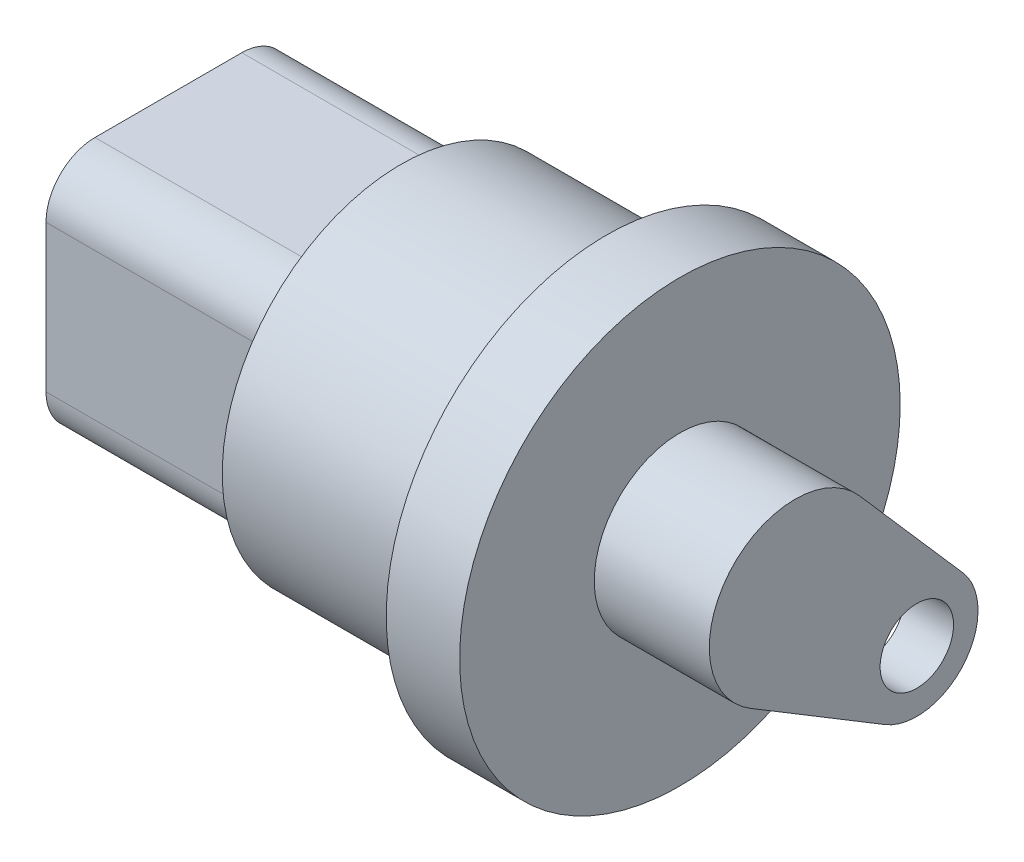
ISO-10303-21;
HEADER;
FILE_DESCRIPTION(('STEP AP214'),'2;1');
FILE_NAME('part.step','',(''),(''),'','','');
FILE_SCHEMA(('AUTOMOTIVE_DESIGN { 1 0 10303 214 1 1 1 1 }'));
ENDSEC;
DATA;
#1=APPLICATION_CONTEXT('core data for automotive mechanical design processes');
#2=APPLICATION_PROTOCOL_DEFINITION('international standard','automotive_design',2000,#1);
#3=PRODUCT_CONTEXT('',#1,'mechanical');
#4=PRODUCT('Part','Part','',(#3));
#5=PRODUCT_RELATED_PRODUCT_CATEGORY('part','',(#4));
#6=PRODUCT_DEFINITION_FORMATION('','',#4);
#7=PRODUCT_DEFINITION_CONTEXT('part definition',#1,'design');
#8=PRODUCT_DEFINITION('design','',#6,#7);
#9=PRODUCT_DEFINITION_SHAPE('','',#8);
#10=(LENGTH_UNIT() NAMED_UNIT(*) SI_UNIT(.MILLI.,.METRE.));
#11=(NAMED_UNIT(*) PLANE_ANGLE_UNIT() SI_UNIT($,.RADIAN.));
#12=(NAMED_UNIT(*) SI_UNIT($,.STERADIAN.) SOLID_ANGLE_UNIT());
#13=UNCERTAINTY_MEASURE_WITH_UNIT(LENGTH_MEASURE(1.E-05),#10,'distance_accuracy_value','');
#14=(GEOMETRIC_REPRESENTATION_CONTEXT(3) GLOBAL_UNCERTAINTY_ASSIGNED_CONTEXT((#13)) GLOBAL_UNIT_ASSIGNED_CONTEXT((#10,
#11,#12)) REPRESENTATION_CONTEXT('',''));
#15=CARTESIAN_POINT('',(0.,0.,0.));
#16=DIRECTION('',(0.,0.,1.));
#17=DIRECTION('',(1.,0.,0.));
#18=AXIS2_PLACEMENT_3D('',#15,#16,#17);
#19=CARTESIAN_POINT('',(3.,0.,0.));
#20=DIRECTION('',(-1.,0.,0.));
#21=DIRECTION('',(0.,0.,1.));
#22=AXIS2_PLACEMENT_3D('',#19,#20,#21);
#23=CYLINDRICAL_SURFACE('',#22,9.);
#24=CARTESIAN_POINT('',(3.,0.,0.));
#25=DIRECTION('',(1.,0.,0.));
#26=DIRECTION('',(0.,0.,-1.));
#27=AXIS2_PLACEMENT_3D('',#24,#25,#26);
#28=CIRCLE('',#27,9.);
#29=CARTESIAN_POINT('',(3.,0.,-9.));
#30=VERTEX_POINT('',#29);
#31=EDGE_CURVE('E175',#30,#30,#28,.T.);
#32=ORIENTED_EDGE('',*,*,#31,.F.);
#33=EDGE_LOOP('',(#32));
#34=FACE_BOUND('',#33,.T.);
#35=CARTESIAN_POINT('',(0.,0.,0.));
#36=DIRECTION('',(1.,0.,0.));
#37=DIRECTION('',(0.,0.,-1.));
#38=AXIS2_PLACEMENT_3D('',#35,#36,#37);
#39=CIRCLE('',#38,9.);
#40=CARTESIAN_POINT('',(0.,0.,-9.));
#41=VERTEX_POINT('',#40);
#42=EDGE_CURVE('E179',#41,#41,#39,.T.);
#43=ORIENTED_EDGE('',*,*,#42,.T.);
#44=EDGE_LOOP('',(#43));
#45=FACE_BOUND('',#44,.T.);
#46=ADVANCED_FACE('F52',(#34,#45),#23,.T.);
#47=CARTESIAN_POINT('',(3.,0.,0.));
#48=DIRECTION('',(1.,0.,0.));
#49=DIRECTION('',(0.,0.,-1.));
#50=AXIS2_PLACEMENT_3D('',#47,#48,#49);
#51=PLANE('',#50);
#52=CARTESIAN_POINT('',(3.,-4.17811946296249,-4.97928888027336));
#53=DIRECTION('',(1.,0.,0.));
#54=DIRECTION('',(0.,0.,-1.));
#55=AXIS2_PLACEMENT_3D('',#52,#53,#54);
#56=CIRCLE('',#55,1.5);
#57=CARTESIAN_POINT('',(3.,-4.17811946296249,-6.47928888027336));
#58=VERTEX_POINT('',#57);
#59=EDGE_CURVE('E166',#58,#58,#56,.T.);
#60=ORIENTED_EDGE('',*,*,#59,.F.);
#61=EDGE_LOOP('',(#60));
#62=FACE_BOUND('',#61,.T.);
#63=CARTESIAN_POINT('',(3.,0.,0.));
#64=DIRECTION('',(1.,0.,0.));
#65=DIRECTION('',(0.,0.,-1.));
#66=AXIS2_PLACEMENT_3D('',#63,#64,#65);
#67=CIRCLE('',#66,3.5);
#68=CARTESIAN_POINT('',(3.,0.,-3.5));
#69=VERTEX_POINT('',#68);
#70=EDGE_CURVE('E178',#69,#69,#67,.T.);
#71=ORIENTED_EDGE('',*,*,#70,.F.);
#72=EDGE_LOOP('',(#71));
#73=FACE_BOUND('',#72,.T.);
#74=ORIENTED_EDGE('',*,*,#31,.T.);
#75=EDGE_LOOP('',(#74));
#76=FACE_BOUND('',#75,.T.);
#77=ADVANCED_FACE('F277',(#62,#73,#76),#51,.T.);
#78=CARTESIAN_POINT('',(0.,0.,0.));
#79=DIRECTION('',(1.,0.,0.));
#80=DIRECTION('',(0.,0.,-1.));
#81=AXIS2_PLACEMENT_3D('',#78,#79,#80);
#82=PLANE('',#81);
#83=CARTESIAN_POINT('',(0.,0.,0.));
#84=DIRECTION('',(1.,0.,0.));
#85=DIRECTION('',(0.,0.,-1.));
#86=AXIS2_PLACEMENT_3D('',#83,#84,#85);
#87=CIRCLE('',#86,7.3);
#88=CARTESIAN_POINT('',(0.,-3.58703931073588,-6.35792017748222));
#89=VERTEX_POINT('',#88);
#90=CARTESIAN_POINT('',(0.,-5.63844624428829,-4.63658537614388));
#91=VERTEX_POINT('',#90);
#92=EDGE_CURVE('E153',#89,#91,#87,.T.);
#93=ORIENTED_EDGE('',*,*,#92,.T.);
#94=CARTESIAN_POINT('',(0.,-4.17811946296249,-4.97928888027336));
#95=DIRECTION('',(1.,0.,0.));
#96=DIRECTION('',(0.,0.,-1.));
#97=AXIS2_PLACEMENT_3D('',#94,#95,#96);
#98=CIRCLE('',#97,1.5);
#99=EDGE_CURVE('E159',#89,#91,#98,.F.);
#100=ORIENTED_EDGE('',*,*,#99,.F.);
#101=EDGE_LOOP('',(#93,#100));
#102=FACE_BOUND('',#101,.T.);
#103=ORIENTED_EDGE('',*,*,#42,.F.);
#104=EDGE_LOOP('',(#103));
#105=FACE_BOUND('',#104,.T.);
#106=ADVANCED_FACE('F164',(#102,#105),#82,.F.);
#107=CARTESIAN_POINT('',(-8.4,0.,0.));
#108=DIRECTION('',(1.,0.,0.));
#109=DIRECTION('',(0.,0.,-1.));
#110=AXIS2_PLACEMENT_3D('',#107,#108,#109);
#111=CYLINDRICAL_SURFACE('',#110,7.3);
#112=CARTESIAN_POINT('',(-8.4,0.,0.));
#113=DIRECTION('',(1.,0.,0.));
#114=DIRECTION('',(0.,0.,-1.));
#115=AXIS2_PLACEMENT_3D('',#112,#113,#114);
#116=CIRCLE('',#115,7.3);
#117=CARTESIAN_POINT('',(-8.4,0.,-7.3));
#118=VERTEX_POINT('',#117);
#119=EDGE_CURVE('E152',#118,#118,#116,.T.);
#120=ORIENTED_EDGE('',*,*,#119,.T.);
#121=EDGE_LOOP('',(#120));
#122=FACE_BOUND('',#121,.T.);
#123=EDGE_CURVE('E145',#91,#89,#87,.T.);
#124=ORIENTED_EDGE('',*,*,#123,.F.);
#125=ORIENTED_EDGE('',*,*,#92,.F.);
#126=EDGE_LOOP('',(#124,#125));
#127=FACE_BOUND('',#126,.T.);
#128=ADVANCED_FACE('F167',(#122,#127),#111,.T.);
#129=CARTESIAN_POINT('',(-8.4,0.,0.));
#130=DIRECTION('',(1.,0.,0.));
#131=DIRECTION('',(0.,0.,-1.));
#132=AXIS2_PLACEMENT_3D('',#129,#130,#131);
#133=PLANE('',#132);
#134=DIRECTION('',(0.,0.,-1.));
#135=VECTOR('',#134,1.);
#136=CARTESIAN_POINT('',(-8.4,5.,0.));
#137=LINE('',#136,#135);
#138=CARTESIAN_POINT('',(-8.4,5.,3.));
#139=VERTEX_POINT('',#138);
#140=CARTESIAN_POINT('',(-8.4,5.,-3.));
#141=VERTEX_POINT('',#140);
#142=EDGE_CURVE('E242',#139,#141,#137,.T.);
#143=ORIENTED_EDGE('',*,*,#142,.F.);
#144=CARTESIAN_POINT('',(-8.4,3.,3.));
#145=DIRECTION('',(1.,0.,0.));
#146=DIRECTION('',(0.,0.,-1.));
#147=AXIS2_PLACEMENT_3D('',#144,#145,#146);
#148=CIRCLE('',#147,2.);
#149=CARTESIAN_POINT('',(-8.4,3.,5.));
#150=VERTEX_POINT('',#149);
#151=EDGE_CURVE('E209',#139,#150,#148,.T.);
#152=ORIENTED_EDGE('',*,*,#151,.T.);
#153=DIRECTION('',(0.,-1.,0.));
#154=VECTOR('',#153,1.);
#155=CARTESIAN_POINT('',(-8.4,0.,5.));
#156=LINE('',#155,#154);
#157=CARTESIAN_POINT('',(-8.4,-3.,5.));
#158=VERTEX_POINT('',#157);
#159=EDGE_CURVE('E219',#150,#158,#156,.T.);
#160=ORIENTED_EDGE('',*,*,#159,.T.);
#161=CARTESIAN_POINT('',(-8.4,-3.,3.));
#162=DIRECTION('',(1.,0.,0.));
#163=DIRECTION('',(0.,0.,-1.));
#164=AXIS2_PLACEMENT_3D('',#161,#162,#163);
#165=CIRCLE('',#164,2.);
#166=CARTESIAN_POINT('',(-8.4,-5.,3.));
#167=VERTEX_POINT('',#166);
#168=EDGE_CURVE('E211',#158,#167,#165,.T.);
#169=ORIENTED_EDGE('',*,*,#168,.T.);
#170=DIRECTION('',(0.,0.,-1.));
#171=VECTOR('',#170,1.);
#172=CARTESIAN_POINT('',(-8.4,-5.,0.));
#173=LINE('',#172,#171);
#174=CARTESIAN_POINT('',(-8.4,-5.,-3.));
#175=VERTEX_POINT('',#174);
#176=EDGE_CURVE('E217',#167,#175,#173,.T.);
#177=ORIENTED_EDGE('',*,*,#176,.T.);
#178=CARTESIAN_POINT('',(-8.4,-3.,-3.));
#179=DIRECTION('',(1.,0.,0.));
#180=DIRECTION('',(0.,0.,-1.));
#181=AXIS2_PLACEMENT_3D('',#178,#179,#180);
#182=CIRCLE('',#181,2.);
#183=CARTESIAN_POINT('',(-8.4,-3.,-5.));
#184=VERTEX_POINT('',#183);
#185=EDGE_CURVE('E60',#175,#184,#182,.T.);
#186=ORIENTED_EDGE('',*,*,#185,.T.);
#187=DIRECTION('',(0.,-1.,0.));
#188=VECTOR('',#187,1.);
#189=CARTESIAN_POINT('',(-8.4,0.,-5.));
#190=LINE('',#189,#188);
#191=CARTESIAN_POINT('',(-8.4,3.,-5.));
#192=VERTEX_POINT('',#191);
#193=EDGE_CURVE('E228',#192,#184,#190,.T.);
#194=ORIENTED_EDGE('',*,*,#193,.F.);
#195=CARTESIAN_POINT('',(-8.4,3.,-3.));
#196=DIRECTION('',(1.,0.,0.));
#197=DIRECTION('',(0.,0.,-1.));
#198=AXIS2_PLACEMENT_3D('',#195,#196,#197);
#199=CIRCLE('',#198,2.);
#200=EDGE_CURVE('E12',#192,#141,#199,.T.);
#201=ORIENTED_EDGE('',*,*,#200,.T.);
#202=EDGE_LOOP('',(#143,#152,#160,#169,#177,#186,#194,#201));
#203=FACE_BOUND('',#202,.T.);
#204=ORIENTED_EDGE('',*,*,#119,.F.);
#205=EDGE_LOOP('',(#204));
#206=FACE_BOUND('',#205,.T.);
#207=ADVANCED_FACE('F215',(#203,#206),#133,.F.);
#208=CARTESIAN_POINT('',(-17.9,0.,5.));
#209=DIRECTION('',(0.,0.,1.));
#210=DIRECTION('',(0.,-1.,0.));
#211=AXIS2_PLACEMENT_3D('',#208,#209,#210);
#212=PLANE('',#211);
#213=ORIENTED_EDGE('',*,*,#159,.F.);
#214=DIRECTION('',(1.,0.,0.));
#215=VECTOR('',#214,1.);
#216=CARTESIAN_POINT('',(-17.9,3.,5.));
#217=LINE('',#216,#215);
#218=CARTESIAN_POINT('',(-17.9,3.,5.));
#219=VERTEX_POINT('',#218);
#220=EDGE_CURVE('E190',#150,#219,#217,.F.);
#221=ORIENTED_EDGE('',*,*,#220,.T.);
#222=DIRECTION('',(0.,-1.,0.));
#223=VECTOR('',#222,1.);
#224=CARTESIAN_POINT('',(-17.9,0.,5.));
#225=LINE('',#224,#223);
#226=CARTESIAN_POINT('',(-17.9,-3.,5.));
#227=VERTEX_POINT('',#226);
#228=EDGE_CURVE('E236',#219,#227,#225,.T.);
#229=ORIENTED_EDGE('',*,*,#228,.T.);
#230=DIRECTION('',(1.,0.,0.));
#231=VECTOR('',#230,1.);
#232=CARTESIAN_POINT('',(-17.9,-3.,5.));
#233=LINE('',#232,#231);
#234=EDGE_CURVE('E187',#227,#158,#233,.T.);
#235=ORIENTED_EDGE('',*,*,#234,.T.);
#236=EDGE_LOOP('',(#213,#221,#229,#235));
#237=FACE_BOUND('',#236,.T.);
#238=ADVANCED_FACE('F240',(#237),#212,.T.);
#239=CARTESIAN_POINT('',(-17.9,5.,0.));
#240=DIRECTION('',(0.,-1.,0.));
#241=DIRECTION('',(0.,0.,-1.));
#242=AXIS2_PLACEMENT_3D('',#239,#240,#241);
#243=PLANE('',#242);
#244=DIRECTION('',(0.,0.,-1.));
#245=VECTOR('',#244,1.);
#246=CARTESIAN_POINT('',(-17.9,5.,0.));
#247=LINE('',#246,#245);
#248=CARTESIAN_POINT('',(-17.9,5.,3.));
#249=VERTEX_POINT('',#248);
#250=CARTESIAN_POINT('',(-17.9,5.,-3.));
#251=VERTEX_POINT('',#250);
#252=EDGE_CURVE('E168',#249,#251,#247,.T.);
#253=ORIENTED_EDGE('',*,*,#252,.F.);
#254=DIRECTION('',(1.,0.,0.));
#255=VECTOR('',#254,1.);
#256=CARTESIAN_POINT('',(-8.4,5.,3.));
#257=LINE('',#256,#255);
#258=EDGE_CURVE('E184',#249,#139,#257,.T.);
#259=ORIENTED_EDGE('',*,*,#258,.T.);
#260=ORIENTED_EDGE('',*,*,#142,.T.);
#261=DIRECTION('',(1.,0.,0.));
#262=VECTOR('',#261,1.);
#263=CARTESIAN_POINT('',(-17.9,5.,-3.));
#264=LINE('',#263,#262);
#265=EDGE_CURVE('E182',#141,#251,#264,.F.);
#266=ORIENTED_EDGE('',*,*,#265,.T.);
#267=EDGE_LOOP('',(#253,#259,#260,#266));
#268=FACE_BOUND('',#267,.T.);
#269=ADVANCED_FACE('F263',(#268),#243,.F.);
#270=CARTESIAN_POINT('',(-17.9,0.,-5.));
#271=DIRECTION('',(0.,0.,1.));
#272=DIRECTION('',(0.,-1.,0.));
#273=AXIS2_PLACEMENT_3D('',#270,#271,#272);
#274=PLANE('',#273);
#275=ORIENTED_EDGE('',*,*,#193,.T.);
#276=DIRECTION('',(1.,0.,0.));
#277=VECTOR('',#276,1.);
#278=CARTESIAN_POINT('',(-17.9,-3.,-5.));
#279=LINE('',#278,#277);
#280=CARTESIAN_POINT('',(-17.9,-3.,-5.));
#281=VERTEX_POINT('',#280);
#282=EDGE_CURVE('E207',#184,#281,#279,.F.);
#283=ORIENTED_EDGE('',*,*,#282,.T.);
#284=DIRECTION('',(0.,-1.,0.));
#285=VECTOR('',#284,1.);
#286=CARTESIAN_POINT('',(-17.9,0.,-5.));
#287=LINE('',#286,#285);
#288=CARTESIAN_POINT('',(-17.9,3.,-5.));
#289=VERTEX_POINT('',#288);
#290=EDGE_CURVE('E170',#289,#281,#287,.T.);
#291=ORIENTED_EDGE('',*,*,#290,.F.);
#292=DIRECTION('',(1.,0.,0.));
#293=VECTOR('',#292,1.);
#294=CARTESIAN_POINT('',(-17.9,3.,-5.));
#295=LINE('',#294,#293);
#296=EDGE_CURVE('E205',#289,#192,#295,.T.);
#297=ORIENTED_EDGE('',*,*,#296,.T.);
#298=EDGE_LOOP('',(#275,#283,#291,#297));
#299=FACE_BOUND('',#298,.T.);
#300=ADVANCED_FACE('F255',(#299),#274,.F.);
#301=CARTESIAN_POINT('',(-17.9,-5.,0.));
#302=DIRECTION('',(0.,-1.,0.));
#303=DIRECTION('',(0.,0.,-1.));
#304=AXIS2_PLACEMENT_3D('',#301,#302,#303);
#305=PLANE('',#304);
#306=ORIENTED_EDGE('',*,*,#176,.F.);
#307=DIRECTION('',(1.,0.,0.));
#308=VECTOR('',#307,1.);
#309=CARTESIAN_POINT('',(-17.9,-5.,3.));
#310=LINE('',#309,#308);
#311=CARTESIAN_POINT('',(-17.9,-5.,3.));
#312=VERTEX_POINT('',#311);
#313=EDGE_CURVE('E203',#167,#312,#310,.F.);
#314=ORIENTED_EDGE('',*,*,#313,.T.);
#315=DIRECTION('',(0.,0.,-1.));
#316=VECTOR('',#315,1.);
#317=CARTESIAN_POINT('',(-17.9,-5.,0.));
#318=LINE('',#317,#316);
#319=CARTESIAN_POINT('',(-17.9,-5.,-3.));
#320=VERTEX_POINT('',#319);
#321=EDGE_CURVE('E238',#312,#320,#318,.T.);
#322=ORIENTED_EDGE('',*,*,#321,.T.);
#323=DIRECTION('',(1.,0.,0.));
#324=VECTOR('',#323,1.);
#325=CARTESIAN_POINT('',(-8.4,-5.,-3.));
#326=LINE('',#325,#324);
#327=EDGE_CURVE('E200',#320,#175,#326,.T.);
#328=ORIENTED_EDGE('',*,*,#327,.T.);
#329=EDGE_LOOP('',(#306,#314,#322,#328));
#330=FACE_BOUND('',#329,.T.);
#331=ADVANCED_FACE('F224',(#330),#305,.T.);
#332=CARTESIAN_POINT('',(-17.9,0.,0.));
#333=DIRECTION('',(1.,0.,0.));
#334=DIRECTION('',(0.,0.,-1.));
#335=AXIS2_PLACEMENT_3D('',#332,#333,#334);
#336=PLANE('',#335);
#337=ORIENTED_EDGE('',*,*,#228,.F.);
#338=CARTESIAN_POINT('',(-17.9,3.,3.));
#339=DIRECTION('',(1.,0.,0.));
#340=DIRECTION('',(0.,0.,-1.));
#341=AXIS2_PLACEMENT_3D('',#338,#339,#340);
#342=CIRCLE('',#341,2.);
#343=EDGE_CURVE('E198',#219,#249,#342,.F.);
#344=ORIENTED_EDGE('',*,*,#343,.T.);
#345=ORIENTED_EDGE('',*,*,#252,.T.);
#346=CARTESIAN_POINT('',(-17.9,3.,-3.));
#347=DIRECTION('',(1.,0.,0.));
#348=DIRECTION('',(0.,0.,-1.));
#349=AXIS2_PLACEMENT_3D('',#346,#347,#348);
#350=CIRCLE('',#349,2.);
#351=EDGE_CURVE('E192',#251,#289,#350,.F.);
#352=ORIENTED_EDGE('',*,*,#351,.T.);
#353=ORIENTED_EDGE('',*,*,#290,.T.);
#354=CARTESIAN_POINT('',(-17.9,-3.,-3.));
#355=DIRECTION('',(1.,0.,0.));
#356=DIRECTION('',(0.,0.,-1.));
#357=AXIS2_PLACEMENT_3D('',#354,#355,#356);
#358=CIRCLE('',#357,2.);
#359=EDGE_CURVE('E194',#281,#320,#358,.F.);
#360=ORIENTED_EDGE('',*,*,#359,.T.);
#361=ORIENTED_EDGE('',*,*,#321,.F.);
#362=CARTESIAN_POINT('',(-17.9,-3.,3.));
#363=DIRECTION('',(1.,0.,0.));
#364=DIRECTION('',(0.,0.,-1.));
#365=AXIS2_PLACEMENT_3D('',#362,#363,#364);
#366=CIRCLE('',#365,2.);
#367=EDGE_CURVE('E196',#312,#227,#366,.F.);
#368=ORIENTED_EDGE('',*,*,#367,.T.);
#369=EDGE_LOOP('',(#337,#344,#345,#352,#353,#360,#361,#368));
#370=FACE_BOUND('',#369,.T.);
#371=ADVANCED_FACE('F235',(#370),#336,.F.);
#372=CARTESIAN_POINT('',(5.7,0.,0.));
#373=DIRECTION('',(-1.,0.,0.));
#374=DIRECTION('',(0.,0.,1.));
#375=AXIS2_PLACEMENT_3D('',#372,#373,#374);
#376=CYLINDRICAL_SURFACE('',#375,3.5);
#377=CARTESIAN_POINT('',(5.7,0.,0.));
#378=DIRECTION('',(1.,0.,0.));
#379=DIRECTION('',(0.,0.,-1.));
#380=AXIS2_PLACEMENT_3D('',#377,#378,#379);
#381=CIRCLE('',#380,3.5);
#382=CARTESIAN_POINT('',(5.7,-2.99535229991587,1.81048739277265));
#383=VERTEX_POINT('',#382);
#384=CARTESIAN_POINT('',(5.7,2.30311948948421,-2.63545833151617));
#385=VERTEX_POINT('',#384);
#386=EDGE_CURVE('E251',#383,#385,#381,.T.);
#387=ORIENTED_EDGE('',*,*,#386,.F.);
#388=DIRECTION('',(-1.,0.,0.));
#389=VECTOR('',#388,1.);
#390=CARTESIAN_POINT('',(7.7,-2.99535229991587,1.81048739277265));
#391=LINE('',#390,#389);
#392=CARTESIAN_POINT('',(7.7,-2.99535229991587,1.81048739277265));
#393=VERTEX_POINT('',#392);
#394=EDGE_CURVE('E568',#393,#383,#391,.T.);
#395=ORIENTED_EDGE('',*,*,#394,.F.);
#396=CARTESIAN_POINT('',(7.7,0.,0.));
#397=DIRECTION('',(1.,0.,0.));
#398=DIRECTION('',(0.,0.,-1.));
#399=AXIS2_PLACEMENT_3D('',#396,#397,#398);
#400=CIRCLE('',#399,3.5);
#401=CARTESIAN_POINT('',(7.7,2.30311948948421,-2.63545833151617));
#402=VERTEX_POINT('',#401);
#403=EDGE_CURVE('E561',#402,#393,#400,.T.);
#404=ORIENTED_EDGE('',*,*,#403,.F.);
#405=DIRECTION('',(-1.,0.,0.));
#406=VECTOR('',#405,1.);
#407=CARTESIAN_POINT('',(7.7,2.30311948948421,-2.63545833151617));
#408=LINE('',#407,#406);
#409=EDGE_CURVE('E580',#402,#385,#408,.T.);
#410=ORIENTED_EDGE('',*,*,#409,.T.);
#411=EDGE_LOOP('',(#387,#395,#404,#410));
#412=FACE_BOUND('',#411,.T.);
#413=ORIENTED_EDGE('',*,*,#70,.T.);
#414=EDGE_LOOP('',(#413));
#415=FACE_BOUND('',#414,.T.);
#416=ADVANCED_FACE('F304',(#412,#415),#376,.T.);
#417=CARTESIAN_POINT('',(5.7,0.,0.));
#418=DIRECTION('',(1.,0.,0.));
#419=DIRECTION('',(0.,0.,-1.));
#420=AXIS2_PLACEMENT_3D('',#417,#418,#419);
#421=PLANE('',#420);
#422=CARTESIAN_POINT('',(5.7,-4.17811946296249,-4.97928888027336));
#423=DIRECTION('',(1.,0.,0.));
#424=DIRECTION('',(0.,0.,-1.));
#425=AXIS2_PLACEMENT_3D('',#422,#423,#424);
#426=CIRCLE('',#425,1.5);
#427=CARTESIAN_POINT('',(5.7,-4.17811946296249,-6.47928888027336));
#428=VERTEX_POINT('',#427);
#429=EDGE_CURVE('E161',#428,#428,#426,.T.);
#430=ORIENTED_EDGE('',*,*,#429,.T.);
#431=EDGE_LOOP('',(#430));
#432=FACE_BOUND('',#431,.T.);
#433=DIRECTION('',(0.,0.517282112220757,0.855814942833106));
#434=VECTOR('',#433,1.);
#435=CARTESIAN_POINT('',(5.7,-2.99535229991587,1.81048739277265));
#436=LINE('',#435,#434);
#437=CARTESIAN_POINT('',(5.7,-6.31765682004526,-3.68608359972147));
#438=VERTEX_POINT('',#437);
#439=EDGE_CURVE('E555',#438,#383,#436,.T.);
#440=ORIENTED_EDGE('',*,*,#439,.T.);
#441=ORIENTED_EDGE('',*,*,#386,.T.);
#442=DIRECTION('',(0.,0.752988094718905,0.658034139852633));
#443=VECTOR('',#442,1.);
#444=CARTESIAN_POINT('',(5.7,2.30311948948421,-2.63545833151617));
#445=LINE('',#444,#443);
#446=CARTESIAN_POINT('',(5.7,-2.53303411333091,-6.86175911707063));
#447=VERTEX_POINT('',#446);
#448=EDGE_CURVE('E571',#447,#385,#445,.T.);
#449=ORIENTED_EDGE('',*,*,#448,.F.);
#450=CARTESIAN_POINT('',(5.7,-4.17811946296249,-4.97928888027336));
#451=DIRECTION('',(1.,0.,0.));
#452=DIRECTION('',(0.,0.,-1.));
#453=AXIS2_PLACEMENT_3D('',#450,#451,#452);
#454=CIRCLE('',#453,2.5);
#455=EDGE_CURVE('E562',#438,#447,#454,.T.);
#456=ORIENTED_EDGE('',*,*,#455,.F.);
#457=EDGE_LOOP('',(#440,#441,#449,#456));
#458=FACE_BOUND('',#457,.T.);
#459=ADVANCED_FACE('F307',(#432,#458),#421,.F.);
#460=CARTESIAN_POINT('',(7.7,0.,0.));
#461=DIRECTION('',(1.,0.,0.));
#462=DIRECTION('',(0.,0.,-1.));
#463=AXIS2_PLACEMENT_3D('',#460,#461,#462);
#464=PLANE('',#463);
#465=DIRECTION('',(0.,0.517282112220757,0.855814942833106));
#466=VECTOR('',#465,1.);
#467=CARTESIAN_POINT('',(7.7,-2.99535229991587,1.81048739277265));
#468=LINE('',#467,#466);
#469=CARTESIAN_POINT('',(7.7,-6.31765682004526,-3.68608359972147));
#470=VERTEX_POINT('',#469);
#471=EDGE_CURVE('E558',#470,#393,#468,.T.);
#472=ORIENTED_EDGE('',*,*,#471,.F.);
#473=CARTESIAN_POINT('',(7.7,-4.17811946296249,-4.97928888027336));
#474=DIRECTION('',(1.,0.,0.));
#475=DIRECTION('',(0.,0.,-1.));
#476=AXIS2_PLACEMENT_3D('',#473,#474,#475);
#477=CIRCLE('',#476,2.5);
#478=CARTESIAN_POINT('',(7.7,-2.53303411333091,-6.86175911707063));
#479=VERTEX_POINT('',#478);
#480=EDGE_CURVE('E566',#470,#479,#477,.T.);
#481=ORIENTED_EDGE('',*,*,#480,.T.);
#482=DIRECTION('',(0.,0.752988094718905,0.658034139852633));
#483=VECTOR('',#482,1.);
#484=CARTESIAN_POINT('',(7.7,2.30311948948421,-2.63545833151617));
#485=LINE('',#484,#483);
#486=EDGE_CURVE('E564',#479,#402,#485,.T.);
#487=ORIENTED_EDGE('',*,*,#486,.T.);
#488=ORIENTED_EDGE('',*,*,#403,.T.);
#489=EDGE_LOOP('',(#472,#481,#487,#488));
#490=FACE_BOUND('',#489,.T.);
#491=CARTESIAN_POINT('',(7.7,-4.17811946296249,-4.97928888027336));
#492=DIRECTION('',(1.,0.,0.));
#493=DIRECTION('',(0.,0.,-1.));
#494=AXIS2_PLACEMENT_3D('',#491,#492,#493);
#495=CIRCLE('',#494,1.5);
#496=CARTESIAN_POINT('',(7.7,-4.17811946296249,-6.47928888027336));
#497=VERTEX_POINT('',#496);
#498=EDGE_CURVE('E551',#497,#497,#495,.T.);
#499=ORIENTED_EDGE('',*,*,#498,.F.);
#500=EDGE_LOOP('',(#499));
#501=FACE_BOUND('',#500,.T.);
#502=ADVANCED_FACE('F313',(#490,#501),#464,.T.);
#503=CARTESIAN_POINT('',(7.7,-2.99535229991587,1.81048739277265));
#504=DIRECTION('',(0.,-0.855814942833106,0.517282112220757));
#505=DIRECTION('',(0.,-0.517282112220757,-0.855814942833106));
#506=AXIS2_PLACEMENT_3D('',#503,#504,#505);
#507=PLANE('',#506);
#508=ORIENTED_EDGE('',*,*,#439,.F.);
#509=DIRECTION('',(-1.,0.,0.));
#510=VECTOR('',#509,1.);
#511=CARTESIAN_POINT('',(7.7,-6.31765682004526,-3.68608359972147));
#512=LINE('',#511,#510);
#513=EDGE_CURVE('E575',#470,#438,#512,.T.);
#514=ORIENTED_EDGE('',*,*,#513,.F.);
#515=ORIENTED_EDGE('',*,*,#471,.T.);
#516=ORIENTED_EDGE('',*,*,#394,.T.);
#517=EDGE_LOOP('',(#508,#514,#515,#516));
#518=FACE_BOUND('',#517,.T.);
#519=ADVANCED_FACE('F309',(#518),#507,.T.);
#520=CARTESIAN_POINT('',(7.7,-4.17811946296249,-4.97928888027336));
#521=DIRECTION('',(-1.,0.,0.));
#522=DIRECTION('',(0.,0.,1.));
#523=AXIS2_PLACEMENT_3D('',#520,#521,#522);
#524=CYLINDRICAL_SURFACE('',#523,2.5);
#525=ORIENTED_EDGE('',*,*,#455,.T.);
#526=DIRECTION('',(-1.,0.,0.));
#527=VECTOR('',#526,1.);
#528=CARTESIAN_POINT('',(7.7,-2.53303411333091,-6.86175911707063));
#529=LINE('',#528,#527);
#530=EDGE_CURVE('E577',#479,#447,#529,.T.);
#531=ORIENTED_EDGE('',*,*,#530,.F.);
#532=ORIENTED_EDGE('',*,*,#480,.F.);
#533=ORIENTED_EDGE('',*,*,#513,.T.);
#534=EDGE_LOOP('',(#525,#531,#532,#533));
#535=FACE_BOUND('',#534,.T.);
#536=ADVANCED_FACE('F312',(#535),#524,.T.);
#537=CARTESIAN_POINT('',(7.7,2.30311948948421,-2.63545833151617));
#538=DIRECTION('',(0.,-0.658034139852633,0.752988094718905));
#539=DIRECTION('',(0.,-0.752988094718905,-0.658034139852633));
#540=AXIS2_PLACEMENT_3D('',#537,#538,#539);
#541=PLANE('',#540);
#542=ORIENTED_EDGE('',*,*,#448,.T.);
#543=ORIENTED_EDGE('',*,*,#409,.F.);
#544=ORIENTED_EDGE('',*,*,#486,.F.);
#545=ORIENTED_EDGE('',*,*,#530,.T.);
#546=EDGE_LOOP('',(#542,#543,#544,#545));
#547=FACE_BOUND('',#546,.T.);
#548=ADVANCED_FACE('F315',(#547),#541,.F.);
#549=CARTESIAN_POINT('',(7.7,-4.17811946296249,-4.97928888027336));
#550=DIRECTION('',(-1.,0.,0.));
#551=DIRECTION('',(0.,0.,1.));
#552=AXIS2_PLACEMENT_3D('',#549,#550,#551);
#553=CYLINDRICAL_SURFACE('',#552,1.5);
#554=ORIENTED_EDGE('',*,*,#498,.T.);
#555=EDGE_LOOP('',(#554));
#556=FACE_BOUND('',#555,.T.);
#557=ORIENTED_EDGE('',*,*,#429,.F.);
#558=EDGE_LOOP('',(#557));
#559=FACE_BOUND('',#558,.T.);
#560=ADVANCED_FACE('F318',(#556,#559),#553,.F.);
#561=CARTESIAN_POINT('',(-4.24264068711929,-4.17811946296249,-4.97928888027336));
#562=DIRECTION('',(1.,0.,0.));
#563=DIRECTION('',(0.,0.,-1.));
#564=AXIS2_PLACEMENT_3D('',#561,#562,#563);
#565=CYLINDRICAL_SURFACE('',#564,1.5);
#566=EDGE_CURVE('E148',#91,#89,#98,.F.);
#567=ORIENTED_EDGE('',*,*,#566,.T.);
#568=ORIENTED_EDGE('',*,*,#99,.T.);
#569=EDGE_LOOP('',(#567,#568));
#570=FACE_BOUND('',#569,.T.);
#571=ORIENTED_EDGE('',*,*,#59,.T.);
#572=EDGE_LOOP('',(#571));
#573=FACE_BOUND('',#572,.T.);
#574=ADVANCED_FACE('F157',(#570,#573),#565,.F.);
#575=CARTESIAN_POINT('',(0.,0.,0.));
#576=DIRECTION('',(1.,0.,0.));
#577=DIRECTION('',(0.,0.,-1.));
#578=AXIS2_PLACEMENT_3D('',#575,#576,#577);
#579=PLANE('',#578);
#580=ORIENTED_EDGE('',*,*,#566,.F.);
#581=ORIENTED_EDGE('',*,*,#123,.T.);
#582=EDGE_LOOP('',(#580,#581));
#583=FACE_BOUND('',#582,.T.);
#584=ADVANCED_FACE('F147',(#583),#579,.T.);
#585=CARTESIAN_POINT('',(-17.9,3.,3.));
#586=DIRECTION('',(-1.,0.,0.));
#587=DIRECTION('',(0.,0.,1.));
#588=AXIS2_PLACEMENT_3D('',#585,#586,#587);
#589=CYLINDRICAL_SURFACE('',#588,2.);
#590=ORIENTED_EDGE('',*,*,#343,.F.);
#591=ORIENTED_EDGE('',*,*,#220,.F.);
#592=ORIENTED_EDGE('',*,*,#151,.F.);
#593=ORIENTED_EDGE('',*,*,#258,.F.);
#594=EDGE_LOOP('',(#590,#591,#592,#593));
#595=FACE_BOUND('',#594,.T.);
#596=ADVANCED_FACE('F266',(#595),#589,.T.);
#597=CARTESIAN_POINT('',(-17.9,-3.,3.));
#598=DIRECTION('',(1.,0.,0.));
#599=DIRECTION('',(0.,0.,-1.));
#600=AXIS2_PLACEMENT_3D('',#597,#598,#599);
#601=CYLINDRICAL_SURFACE('',#600,2.);
#602=ORIENTED_EDGE('',*,*,#367,.F.);
#603=ORIENTED_EDGE('',*,*,#313,.F.);
#604=ORIENTED_EDGE('',*,*,#168,.F.);
#605=ORIENTED_EDGE('',*,*,#234,.F.);
#606=EDGE_LOOP('',(#602,#603,#604,#605));
#607=FACE_BOUND('',#606,.T.);
#608=ADVANCED_FACE('F231',(#607),#601,.T.);
#609=CARTESIAN_POINT('',(-17.9,-3.,-3.));
#610=DIRECTION('',(-1.,0.,0.));
#611=DIRECTION('',(0.,0.,1.));
#612=AXIS2_PLACEMENT_3D('',#609,#610,#611);
#613=CYLINDRICAL_SURFACE('',#612,2.);
#614=ORIENTED_EDGE('',*,*,#359,.F.);
#615=ORIENTED_EDGE('',*,*,#282,.F.);
#616=ORIENTED_EDGE('',*,*,#185,.F.);
#617=ORIENTED_EDGE('',*,*,#327,.F.);
#618=EDGE_LOOP('',(#614,#615,#616,#617));
#619=FACE_BOUND('',#618,.T.);
#620=ADVANCED_FACE('F259',(#619),#613,.T.);
#621=CARTESIAN_POINT('',(-17.9,3.,-3.));
#622=DIRECTION('',(1.,0.,0.));
#623=DIRECTION('',(0.,0.,-1.));
#624=AXIS2_PLACEMENT_3D('',#621,#622,#623);
#625=CYLINDRICAL_SURFACE('',#624,2.);
#626=ORIENTED_EDGE('',*,*,#351,.F.);
#627=ORIENTED_EDGE('',*,*,#265,.F.);
#628=ORIENTED_EDGE('',*,*,#200,.F.);
#629=ORIENTED_EDGE('',*,*,#296,.F.);
#630=EDGE_LOOP('',(#626,#627,#628,#629));
#631=FACE_BOUND('',#630,.T.);
#632=ADVANCED_FACE('F54',(#631),#625,.T.);
#633=CLOSED_SHELL('',(#46,#77,#106,#128,#207,#238,#269,#300,#331,#371,#416,#459,#502,#519,#536,
#548,#560,#574,#584,#596,#608,#620,#632));
#634=MANIFOLD_SOLID_BREP('B2',#633);
#635=ADVANCED_BREP_SHAPE_REPRESENTATION('',(#18,#634),#14);
#636=SHAPE_DEFINITION_REPRESENTATION(#9,#635);
ENDSEC;
END-ISO-10303-21;
